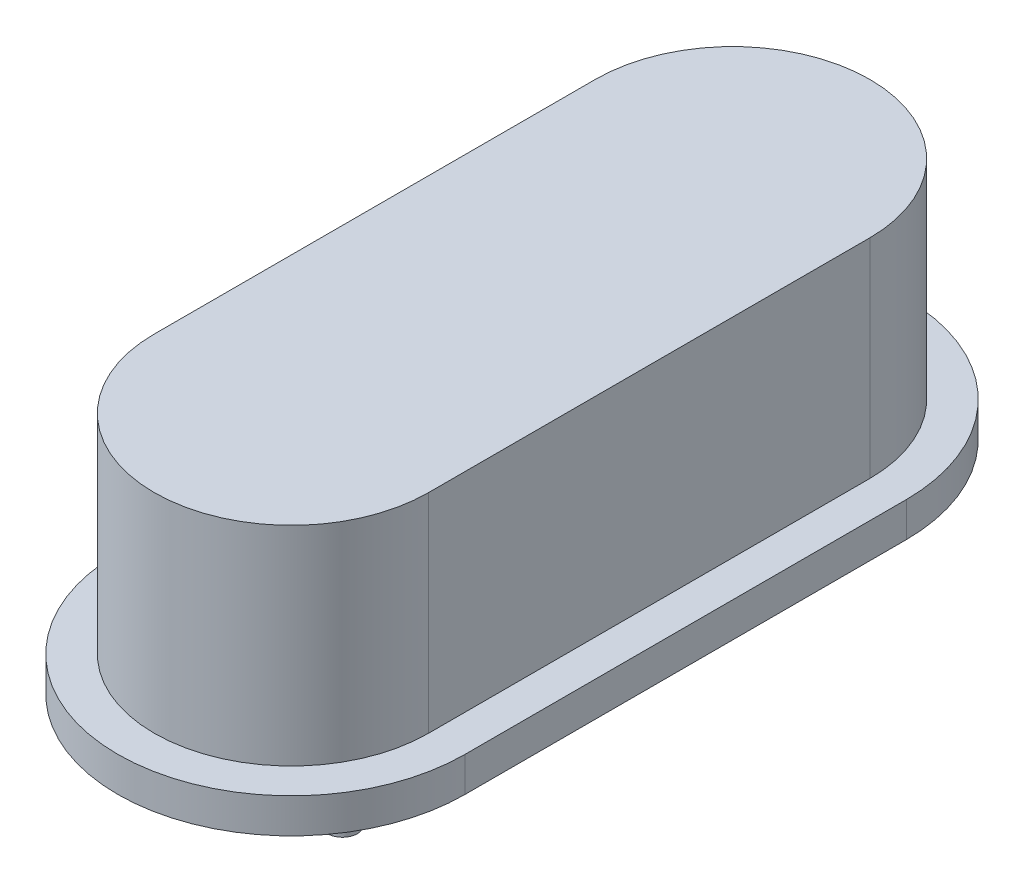
ISO-10303-21;
HEADER;
FILE_DESCRIPTION(('STEP AP214'),'2;1');
FILE_NAME('part.step','',(''),(''),'','','');
FILE_SCHEMA(('AUTOMOTIVE_DESIGN { 1 0 10303 214 1 1 1 1 }'));
ENDSEC;
DATA;
#1=APPLICATION_CONTEXT('core data for automotive mechanical design processes');
#2=APPLICATION_PROTOCOL_DEFINITION('international standard','automotive_design',2000,#1);
#3=PRODUCT_CONTEXT('',#1,'mechanical');
#4=PRODUCT('Part','Part','',(#3));
#5=PRODUCT_RELATED_PRODUCT_CATEGORY('part','',(#4));
#6=PRODUCT_DEFINITION_FORMATION('','',#4);
#7=PRODUCT_DEFINITION_CONTEXT('part definition',#1,'design');
#8=PRODUCT_DEFINITION('design','',#6,#7);
#9=PRODUCT_DEFINITION_SHAPE('','',#8);
#10=(LENGTH_UNIT() NAMED_UNIT(*) SI_UNIT(.MILLI.,.METRE.));
#11=(NAMED_UNIT(*) PLANE_ANGLE_UNIT() SI_UNIT($,.RADIAN.));
#12=(NAMED_UNIT(*) SI_UNIT($,.STERADIAN.) SOLID_ANGLE_UNIT());
#13=UNCERTAINTY_MEASURE_WITH_UNIT(LENGTH_MEASURE(1.E-05),#10,'distance_accuracy_value','');
#14=(GEOMETRIC_REPRESENTATION_CONTEXT(3) GLOBAL_UNCERTAINTY_ASSIGNED_CONTEXT((#13)) GLOBAL_UNIT_ASSIGNED_CONTEXT((#10,
#11,#12)) REPRESENTATION_CONTEXT('',''));
#15=CARTESIAN_POINT('',(0.,0.,0.));
#16=DIRECTION('',(0.,0.,1.));
#17=DIRECTION('',(1.,0.,0.));
#18=AXIS2_PLACEMENT_3D('',#15,#16,#17);
#19=CARTESIAN_POINT('',(0.,0.,-2.44));
#20=DIRECTION('',(0.,-1.,0.));
#21=DIRECTION('',(1.,0.,0.));
#22=AXIS2_PLACEMENT_3D('',#19,#20,#21);
#23=CYLINDRICAL_SURFACE('',#22,0.215);
#24=CARTESIAN_POINT('',(0.,-2.,-2.44));
#25=DIRECTION('',(0.,-1.,0.));
#26=DIRECTION('',(1.,0.,0.));
#27=AXIS2_PLACEMENT_3D('',#24,#25,#26);
#28=CIRCLE('',#27,0.215);
#29=CARTESIAN_POINT('',(-0.215,-2.,-2.44));
#30=VERTEX_POINT('',#29);
#31=EDGE_CURVE('E27',#30,#30,#28,.T.);
#32=ORIENTED_EDGE('',*,*,#31,.F.);
#33=DIRECTION('',(0.,1.,0.));
#34=VECTOR('',#33,1.);
#35=CARTESIAN_POINT('',(-0.215,0.,-2.44));
#36=LINE('',#35,#34);
#37=CARTESIAN_POINT('',(-0.215,0.,-2.44));
#38=VERTEX_POINT('',#37);
#39=EDGE_CURVE('E11',#30,#38,#36,.T.);
#40=ORIENTED_EDGE('',*,*,#39,.T.);
#41=CARTESIAN_POINT('',(0.,0.,-2.44));
#42=DIRECTION('',(0.,1.,0.));
#43=DIRECTION('',(1.,0.,0.));
#44=AXIS2_PLACEMENT_3D('',#41,#42,#43);
#45=CIRCLE('',#44,0.215);
#46=EDGE_CURVE('E183',#38,#38,#45,.T.);
#47=ORIENTED_EDGE('',*,*,#46,.F.);
#48=ORIENTED_EDGE('',*,*,#39,.F.);
#49=EDGE_LOOP('',(#32,#40,#47,#48));
#50=FACE_BOUND('',#49,.T.);
#51=ADVANCED_FACE('F16',(#50),#23,.T.);
#52=CARTESIAN_POINT('',(0.,-2.,-2.44));
#53=DIRECTION('',(0.,1.,0.));
#54=DIRECTION('',(1.,0.,0.));
#55=AXIS2_PLACEMENT_3D('',#52,#53,#54);
#56=PLANE('',#55);
#57=ORIENTED_EDGE('',*,*,#31,.T.);
#58=EDGE_LOOP('',(#57));
#59=FACE_BOUND('',#58,.T.);
#60=ADVANCED_FACE('F318',(#59),#56,.F.);
#61=CARTESIAN_POINT('',(0.,0.,2.44));
#62=DIRECTION('',(0.,-1.,0.));
#63=DIRECTION('',(1.,0.,0.));
#64=AXIS2_PLACEMENT_3D('',#61,#62,#63);
#65=CYLINDRICAL_SURFACE('',#64,0.215);
#66=CARTESIAN_POINT('',(0.,-2.,2.44));
#67=DIRECTION('',(0.,-1.,0.));
#68=DIRECTION('',(1.,0.,0.));
#69=AXIS2_PLACEMENT_3D('',#66,#67,#68);
#70=CIRCLE('',#69,0.215);
#71=CARTESIAN_POINT('',(-0.215,-2.,2.44));
#72=VERTEX_POINT('',#71);
#73=EDGE_CURVE('E174',#72,#72,#70,.T.);
#74=ORIENTED_EDGE('',*,*,#73,.F.);
#75=DIRECTION('',(0.,1.,0.));
#76=VECTOR('',#75,1.);
#77=CARTESIAN_POINT('',(-0.215,0.,2.44));
#78=LINE('',#77,#76);
#79=CARTESIAN_POINT('',(-0.215,0.,2.44));
#80=VERTEX_POINT('',#79);
#81=EDGE_CURVE('E178',#72,#80,#78,.T.);
#82=ORIENTED_EDGE('',*,*,#81,.T.);
#83=CARTESIAN_POINT('',(0.,0.,2.44));
#84=DIRECTION('',(0.,1.,0.));
#85=DIRECTION('',(1.,0.,0.));
#86=AXIS2_PLACEMENT_3D('',#83,#84,#85);
#87=CIRCLE('',#86,0.215);
#88=EDGE_CURVE('E179',#80,#80,#87,.T.);
#89=ORIENTED_EDGE('',*,*,#88,.F.);
#90=ORIENTED_EDGE('',*,*,#81,.F.);
#91=EDGE_LOOP('',(#74,#82,#89,#90));
#92=FACE_BOUND('',#91,.T.);
#93=ADVANCED_FACE('F384',(#92),#65,.T.);
#94=CARTESIAN_POINT('',(0.,-2.,2.44));
#95=DIRECTION('',(0.,1.,0.));
#96=DIRECTION('',(1.,0.,0.));
#97=AXIS2_PLACEMENT_3D('',#94,#95,#96);
#98=PLANE('',#97);
#99=ORIENTED_EDGE('',*,*,#73,.T.);
#100=EDGE_LOOP('',(#99));
#101=FACE_BOUND('',#100,.T.);
#102=ADVANCED_FACE('F18',(#101),#98,.F.);
#103=CARTESIAN_POINT('',(-1.975,3.5,-3.175));
#104=DIRECTION('',(1.,0.,0.));
#105=DIRECTION('',(0.,0.,1.));
#106=AXIS2_PLACEMENT_3D('',#103,#104,#105);
#107=PLANE('',#106);
#108=DIRECTION('',(0.,0.,1.));
#109=VECTOR('',#108,1.);
#110=CARTESIAN_POINT('',(-1.975,3.5,-1.5875));
#111=LINE('',#110,#109);
#112=CARTESIAN_POINT('',(-1.975,3.5,-3.175));
#113=VERTEX_POINT('',#112);
#114=CARTESIAN_POINT('',(-1.975,3.5,3.175));
#115=VERTEX_POINT('',#114);
#116=EDGE_CURVE('E20',#113,#115,#111,.T.);
#117=ORIENTED_EDGE('',*,*,#116,.F.);
#118=DIRECTION('',(0.,-1.,0.));
#119=VECTOR('',#118,1.);
#120=CARTESIAN_POINT('',(-1.975,3.5,-3.175));
#121=LINE('',#120,#119);
#122=CARTESIAN_POINT('',(-1.975,0.5,-3.175));
#123=VERTEX_POINT('',#122);
#124=EDGE_CURVE('E163',#113,#123,#121,.T.);
#125=ORIENTED_EDGE('',*,*,#124,.T.);
#126=DIRECTION('',(0.,0.,1.));
#127=VECTOR('',#126,1.);
#128=CARTESIAN_POINT('',(-1.975,0.5,-3.175));
#129=LINE('',#128,#127);
#130=CARTESIAN_POINT('',(-1.975,0.5,3.175));
#131=VERTEX_POINT('',#130);
#132=EDGE_CURVE('E159',#123,#131,#129,.T.);
#133=ORIENTED_EDGE('',*,*,#132,.T.);
#134=DIRECTION('',(0.,-1.,0.));
#135=VECTOR('',#134,1.);
#136=CARTESIAN_POINT('',(-1.975,3.5,3.175));
#137=LINE('',#136,#135);
#138=EDGE_CURVE('E173',#115,#131,#137,.T.);
#139=ORIENTED_EDGE('',*,*,#138,.F.);
#140=EDGE_LOOP('',(#117,#125,#133,#139));
#141=FACE_BOUND('',#140,.T.);
#142=ADVANCED_FACE('F303',(#141),#107,.F.);
#143=CARTESIAN_POINT('',(0.,3.5,-3.175));
#144=DIRECTION('',(0.,-1.,0.));
#145=DIRECTION('',(1.,0.,0.));
#146=AXIS2_PLACEMENT_3D('',#143,#144,#145);
#147=CYLINDRICAL_SURFACE('',#146,1.975);
#148=CARTESIAN_POINT('',(0.,3.5,-3.175));
#149=DIRECTION('',(0.,1.,0.));
#150=DIRECTION('',(1.,0.,0.));
#151=AXIS2_PLACEMENT_3D('',#148,#149,#150);
#152=CIRCLE('',#151,1.975);
#153=CARTESIAN_POINT('',(1.975,3.5,-3.175));
#154=VERTEX_POINT('',#153);
#155=EDGE_CURVE('E215',#154,#113,#152,.T.);
#156=ORIENTED_EDGE('',*,*,#155,.F.);
#157=DIRECTION('',(0.,-1.,0.));
#158=VECTOR('',#157,1.);
#159=CARTESIAN_POINT('',(1.975,3.5,-3.175));
#160=LINE('',#159,#158);
#161=CARTESIAN_POINT('',(1.975,0.5,-3.175));
#162=VERTEX_POINT('',#161);
#163=EDGE_CURVE('E164',#154,#162,#160,.T.);
#164=ORIENTED_EDGE('',*,*,#163,.T.);
#165=CARTESIAN_POINT('',(0.,0.5,-3.175));
#166=DIRECTION('',(0.,1.,0.));
#167=DIRECTION('',(1.,0.,0.));
#168=AXIS2_PLACEMENT_3D('',#165,#166,#167);
#169=CIRCLE('',#168,1.975);
#170=EDGE_CURVE('E165',#162,#123,#169,.T.);
#171=ORIENTED_EDGE('',*,*,#170,.T.);
#172=ORIENTED_EDGE('',*,*,#124,.F.);
#173=EDGE_LOOP('',(#156,#164,#171,#172));
#174=FACE_BOUND('',#173,.T.);
#175=ADVANCED_FACE('F257',(#174),#147,.T.);
#176=CARTESIAN_POINT('',(1.975,3.5,3.175));
#177=DIRECTION('',(-1.,0.,0.));
#178=DIRECTION('',(0.,0.,1.));
#179=AXIS2_PLACEMENT_3D('',#176,#177,#178);
#180=PLANE('',#179);
#181=DIRECTION('',(0.,0.,-1.));
#182=VECTOR('',#181,1.);
#183=CARTESIAN_POINT('',(1.975,3.5,1.5875));
#184=LINE('',#183,#182);
#185=CARTESIAN_POINT('',(1.975,3.5,3.175));
#186=VERTEX_POINT('',#185);
#187=EDGE_CURVE('E194',#186,#154,#184,.T.);
#188=ORIENTED_EDGE('',*,*,#187,.F.);
#189=DIRECTION('',(0.,-1.,0.));
#190=VECTOR('',#189,1.);
#191=CARTESIAN_POINT('',(1.975,3.5,3.175));
#192=LINE('',#191,#190);
#193=CARTESIAN_POINT('',(1.975,0.5,3.175));
#194=VERTEX_POINT('',#193);
#195=EDGE_CURVE('E169',#186,#194,#192,.T.);
#196=ORIENTED_EDGE('',*,*,#195,.T.);
#197=DIRECTION('',(0.,0.,-1.));
#198=VECTOR('',#197,1.);
#199=CARTESIAN_POINT('',(1.975,0.5,3.175));
#200=LINE('',#199,#198);
#201=EDGE_CURVE('E187',#194,#162,#200,.T.);
#202=ORIENTED_EDGE('',*,*,#201,.T.);
#203=ORIENTED_EDGE('',*,*,#163,.F.);
#204=EDGE_LOOP('',(#188,#196,#202,#203));
#205=FACE_BOUND('',#204,.T.);
#206=ADVANCED_FACE('F246',(#205),#180,.F.);
#207=CARTESIAN_POINT('',(0.,3.5,3.175));
#208=DIRECTION('',(0.,-1.,0.));
#209=DIRECTION('',(-1.,0.,0.));
#210=AXIS2_PLACEMENT_3D('',#207,#208,#209);
#211=CYLINDRICAL_SURFACE('',#210,1.975);
#212=CARTESIAN_POINT('',(0.,3.5,3.175));
#213=DIRECTION('',(0.,1.,0.));
#214=DIRECTION('',(-1.,0.,0.));
#215=AXIS2_PLACEMENT_3D('',#212,#213,#214);
#216=CIRCLE('',#215,1.975);
#217=EDGE_CURVE('E191',#115,#186,#216,.T.);
#218=ORIENTED_EDGE('',*,*,#217,.F.);
#219=ORIENTED_EDGE('',*,*,#138,.T.);
#220=CARTESIAN_POINT('',(0.,0.5,3.175));
#221=DIRECTION('',(0.,1.,0.));
#222=DIRECTION('',(-1.,0.,0.));
#223=AXIS2_PLACEMENT_3D('',#220,#221,#222);
#224=CIRCLE('',#223,1.975);
#225=EDGE_CURVE('E140',#131,#194,#224,.T.);
#226=ORIENTED_EDGE('',*,*,#225,.T.);
#227=ORIENTED_EDGE('',*,*,#195,.F.);
#228=EDGE_LOOP('',(#218,#219,#226,#227));
#229=FACE_BOUND('',#228,.T.);
#230=ADVANCED_FACE('F251',(#229),#211,.T.);
#231=CARTESIAN_POINT('',(0.,0.5,0.));
#232=DIRECTION('',(0.,1.,0.));
#233=DIRECTION('',(1.,0.,0.));
#234=AXIS2_PLACEMENT_3D('',#231,#232,#233);
#235=PLANE('',#234);
#236=CARTESIAN_POINT('',(0.,0.5,-3.175));
#237=DIRECTION('',(0.,-1.,0.));
#238=DIRECTION('',(0.707106781186547,0.,-0.707106781186548));
#239=AXIS2_PLACEMENT_3D('',#236,#237,#238);
#240=CIRCLE('',#239,2.5);
#241=CARTESIAN_POINT('',(-2.5,0.5,-3.175));
#242=VERTEX_POINT('',#241);
#243=CARTESIAN_POINT('',(2.5,0.5,-3.175));
#244=VERTEX_POINT('',#243);
#245=EDGE_CURVE('E120',#242,#244,#240,.T.);
#246=ORIENTED_EDGE('',*,*,#245,.F.);
#247=DIRECTION('',(0.,0.,-1.));
#248=VECTOR('',#247,1.);
#249=CARTESIAN_POINT('',(-2.5,0.5,-2.8375));
#250=LINE('',#249,#248);
#251=CARTESIAN_POINT('',(-2.5,0.5,3.175));
#252=VERTEX_POINT('',#251);
#253=EDGE_CURVE('E124',#252,#242,#250,.T.);
#254=ORIENTED_EDGE('',*,*,#253,.F.);
#255=CARTESIAN_POINT('',(0.,0.5,3.175));
#256=DIRECTION('',(0.,-1.,0.));
#257=DIRECTION('',(0.707106781186547,0.,0.707106781186548));
#258=AXIS2_PLACEMENT_3D('',#255,#256,#257);
#259=CIRCLE('',#258,2.5);
#260=CARTESIAN_POINT('',(2.5,0.5,3.175));
#261=VERTEX_POINT('',#260);
#262=EDGE_CURVE('E211',#261,#252,#259,.T.);
#263=ORIENTED_EDGE('',*,*,#262,.F.);
#264=DIRECTION('',(0.,0.,1.));
#265=VECTOR('',#264,1.);
#266=CARTESIAN_POINT('',(2.5,0.5,2.8375));
#267=LINE('',#266,#265);
#268=EDGE_CURVE('E93',#244,#261,#267,.T.);
#269=ORIENTED_EDGE('',*,*,#268,.F.);
#270=EDGE_LOOP('',(#246,#254,#263,#269));
#271=FACE_BOUND('',#270,.T.);
#272=ORIENTED_EDGE('',*,*,#225,.F.);
#273=ORIENTED_EDGE('',*,*,#132,.F.);
#274=ORIENTED_EDGE('',*,*,#170,.F.);
#275=ORIENTED_EDGE('',*,*,#201,.F.);
#276=EDGE_LOOP('',(#272,#273,#274,#275));
#277=FACE_BOUND('',#276,.T.);
#278=ADVANCED_FACE('F122',(#271,#277),#235,.T.);
#279=CARTESIAN_POINT('',(-2.5,0.,-5.675));
#280=DIRECTION('',(-1.,0.,0.));
#281=DIRECTION('',(0.,0.,1.));
#282=AXIS2_PLACEMENT_3D('',#279,#280,#281);
#283=PLANE('',#282);
#284=ORIENTED_EDGE('',*,*,#253,.T.);
#285=DIRECTION('',(0.,1.,0.));
#286=VECTOR('',#285,1.);
#287=CARTESIAN_POINT('',(-2.5,0.,-3.175));
#288=LINE('',#287,#286);
#289=CARTESIAN_POINT('',(-2.5,0.,-3.175));
#290=VERTEX_POINT('',#289);
#291=EDGE_CURVE('E136',#290,#242,#288,.T.);
#292=ORIENTED_EDGE('',*,*,#291,.F.);
#293=DIRECTION('',(0.,0.,-1.));
#294=VECTOR('',#293,1.);
#295=CARTESIAN_POINT('',(-2.5,0.,5.675));
#296=LINE('',#295,#294);
#297=CARTESIAN_POINT('',(-2.5,0.,3.175));
#298=VERTEX_POINT('',#297);
#299=EDGE_CURVE('E155',#298,#290,#296,.T.);
#300=ORIENTED_EDGE('',*,*,#299,.F.);
#301=DIRECTION('',(0.,-1.,0.));
#302=VECTOR('',#301,1.);
#303=CARTESIAN_POINT('',(-2.5,0.,3.175));
#304=LINE('',#303,#302);
#305=EDGE_CURVE('E138',#252,#298,#304,.T.);
#306=ORIENTED_EDGE('',*,*,#305,.F.);
#307=EDGE_LOOP('',(#284,#292,#300,#306));
#308=FACE_BOUND('',#307,.T.);
#309=ADVANCED_FACE('F134',(#308),#283,.T.);
#310=CARTESIAN_POINT('',(0.,0.,-3.175));
#311=DIRECTION('',(0.,1.,0.));
#312=DIRECTION('',(0.707106781186547,0.,-0.707106781186548));
#313=AXIS2_PLACEMENT_3D('',#310,#311,#312);
#314=CYLINDRICAL_SURFACE('',#313,2.5);
#315=ORIENTED_EDGE('',*,*,#245,.T.);
#316=DIRECTION('',(0.,-1.,0.));
#317=VECTOR('',#316,1.);
#318=CARTESIAN_POINT('',(2.5,0.,-3.175));
#319=LINE('',#318,#317);
#320=CARTESIAN_POINT('',(2.5,0.,-3.175));
#321=VERTEX_POINT('',#320);
#322=EDGE_CURVE('E130',#244,#321,#319,.T.);
#323=ORIENTED_EDGE('',*,*,#322,.T.);
#324=CARTESIAN_POINT('',(0.,0.,-3.175));
#325=DIRECTION('',(0.,1.,0.));
#326=DIRECTION('',(0.707106781186547,0.,-0.707106781186548));
#327=AXIS2_PLACEMENT_3D('',#324,#325,#326);
#328=CIRCLE('',#327,2.5);
#329=EDGE_CURVE('E144',#321,#290,#328,.T.);
#330=ORIENTED_EDGE('',*,*,#329,.T.);
#331=ORIENTED_EDGE('',*,*,#291,.T.);
#332=EDGE_LOOP('',(#315,#323,#330,#331));
#333=FACE_BOUND('',#332,.T.);
#334=ADVANCED_FACE('F142',(#333),#314,.T.);
#335=CARTESIAN_POINT('',(0.,0.,0.));
#336=DIRECTION('',(0.,1.,0.));
#337=DIRECTION('',(1.,0.,0.));
#338=AXIS2_PLACEMENT_3D('',#335,#336,#337);
#339=PLANE('',#338);
#340=ORIENTED_EDGE('',*,*,#329,.F.);
#341=DIRECTION('',(0.,0.,1.));
#342=VECTOR('',#341,1.);
#343=CARTESIAN_POINT('',(2.5,0.,-5.675));
#344=LINE('',#343,#342);
#345=CARTESIAN_POINT('',(2.5,0.,3.175));
#346=VERTEX_POINT('',#345);
#347=EDGE_CURVE('E146',#321,#346,#344,.T.);
#348=ORIENTED_EDGE('',*,*,#347,.T.);
#349=CARTESIAN_POINT('',(0.,0.,3.175));
#350=DIRECTION('',(0.,1.,0.));
#351=DIRECTION('',(-0.707106781186548,0.,0.707106781186547));
#352=AXIS2_PLACEMENT_3D('',#349,#350,#351);
#353=CIRCLE('',#352,2.5);
#354=EDGE_CURVE('E212',#298,#346,#353,.T.);
#355=ORIENTED_EDGE('',*,*,#354,.F.);
#356=ORIENTED_EDGE('',*,*,#299,.T.);
#357=EDGE_LOOP('',(#340,#348,#355,#356));
#358=FACE_BOUND('',#357,.T.);
#359=ORIENTED_EDGE('',*,*,#46,.T.);
#360=EDGE_LOOP('',(#359));
#361=FACE_BOUND('',#360,.T.);
#362=ORIENTED_EDGE('',*,*,#88,.T.);
#363=EDGE_LOOP('',(#362));
#364=FACE_BOUND('',#363,.T.);
#365=ADVANCED_FACE('F338',(#358,#361,#364),#339,.F.);
#366=CARTESIAN_POINT('',(0.,3.5,0.));
#367=DIRECTION('',(0.,1.,0.));
#368=DIRECTION('',(1.,0.,0.));
#369=AXIS2_PLACEMENT_3D('',#366,#367,#368);
#370=PLANE('',#369);
#371=ORIENTED_EDGE('',*,*,#116,.T.);
#372=ORIENTED_EDGE('',*,*,#217,.T.);
#373=ORIENTED_EDGE('',*,*,#187,.T.);
#374=ORIENTED_EDGE('',*,*,#155,.T.);
#375=EDGE_LOOP('',(#371,#372,#373,#374));
#376=FACE_BOUND('',#375,.T.);
#377=ADVANCED_FACE('F332',(#376),#370,.T.);
#378=CARTESIAN_POINT('',(0.,0.,3.175));
#379=DIRECTION('',(0.,1.,0.));
#380=DIRECTION('',(0.707106781186547,0.,0.707106781186548));
#381=AXIS2_PLACEMENT_3D('',#378,#379,#380);
#382=CYLINDRICAL_SURFACE('',#381,2.5);
#383=ORIENTED_EDGE('',*,*,#262,.T.);
#384=ORIENTED_EDGE('',*,*,#305,.T.);
#385=ORIENTED_EDGE('',*,*,#354,.T.);
#386=DIRECTION('',(0.,1.,0.));
#387=VECTOR('',#386,1.);
#388=CARTESIAN_POINT('',(2.5,0.,3.175));
#389=LINE('',#388,#387);
#390=EDGE_CURVE('E224',#346,#261,#389,.T.);
#391=ORIENTED_EDGE('',*,*,#390,.T.);
#392=EDGE_LOOP('',(#383,#384,#385,#391));
#393=FACE_BOUND('',#392,.T.);
#394=ADVANCED_FACE('F337',(#393),#382,.T.);
#395=CARTESIAN_POINT('',(2.5,0.,5.675));
#396=DIRECTION('',(1.,0.,0.));
#397=DIRECTION('',(0.,0.,1.));
#398=AXIS2_PLACEMENT_3D('',#395,#396,#397);
#399=PLANE('',#398);
#400=ORIENTED_EDGE('',*,*,#268,.T.);
#401=ORIENTED_EDGE('',*,*,#390,.F.);
#402=ORIENTED_EDGE('',*,*,#347,.F.);
#403=ORIENTED_EDGE('',*,*,#322,.F.);
#404=EDGE_LOOP('',(#400,#401,#402,#403));
#405=FACE_BOUND('',#404,.T.);
#406=ADVANCED_FACE('F348',(#405),#399,.T.);
#407=CLOSED_SHELL('',(#51,#60,#93,#102,#142,#175,#206,#230,#278,#309,#334,#365,#377,#394,#406));
#408=MANIFOLD_SOLID_BREP('B1',#407);
#409=ADVANCED_BREP_SHAPE_REPRESENTATION('',(#18,#408),#14);
#410=SHAPE_DEFINITION_REPRESENTATION(#9,#409);
ENDSEC;
END-ISO-10303-21;
